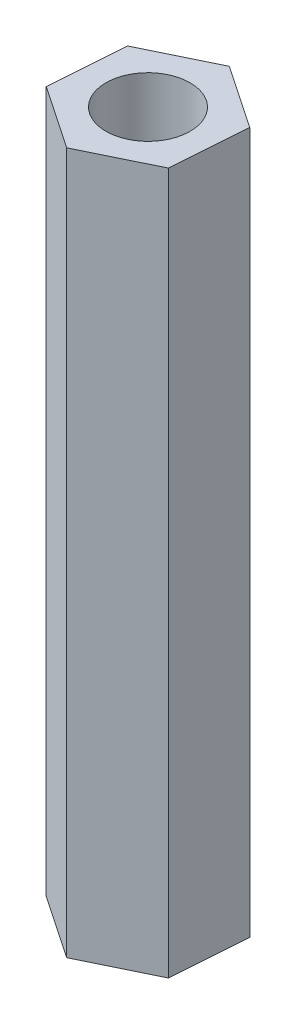
ISO-10303-21;
HEADER;
FILE_DESCRIPTION(('STEP AP214'),'2;1');
FILE_NAME('part.step','',(''),(''),'','','');
FILE_SCHEMA(('AUTOMOTIVE_DESIGN { 1 0 10303 214 1 1 1 1 }'));
ENDSEC;
DATA;
#1=APPLICATION_CONTEXT('core data for automotive mechanical design processes');
#2=APPLICATION_PROTOCOL_DEFINITION('international standard','automotive_design',2000,#1);
#3=PRODUCT_CONTEXT('',#1,'mechanical');
#4=PRODUCT('Part','Part','',(#3));
#5=PRODUCT_RELATED_PRODUCT_CATEGORY('part','',(#4));
#6=PRODUCT_DEFINITION_FORMATION('','',#4);
#7=PRODUCT_DEFINITION_CONTEXT('part definition',#1,'design');
#8=PRODUCT_DEFINITION('design','',#6,#7);
#9=PRODUCT_DEFINITION_SHAPE('','',#8);
#10=(LENGTH_UNIT() NAMED_UNIT(*) SI_UNIT(.MILLI.,.METRE.));
#11=(NAMED_UNIT(*) PLANE_ANGLE_UNIT() SI_UNIT($,.RADIAN.));
#12=(NAMED_UNIT(*) SI_UNIT($,.STERADIAN.) SOLID_ANGLE_UNIT());
#13=UNCERTAINTY_MEASURE_WITH_UNIT(LENGTH_MEASURE(1.E-05),#10,'distance_accuracy_value','');
#14=(GEOMETRIC_REPRESENTATION_CONTEXT(3) GLOBAL_UNCERTAINTY_ASSIGNED_CONTEXT((#13)) GLOBAL_UNIT_ASSIGNED_CONTEXT((#10,
#11,#12)) REPRESENTATION_CONTEXT('',''));
#15=CARTESIAN_POINT('',(0.,0.,0.));
#16=DIRECTION('',(0.,0.,1.));
#17=DIRECTION('',(1.,0.,0.));
#18=AXIS2_PLACEMENT_3D('',#15,#16,#17);
#19=CARTESIAN_POINT('',(2.24764100196597,25.,1.5203431387732));
#20=DIRECTION('',(-0.997471762467216,0.,-0.0710639365680323));
#21=DIRECTION('',(-0.0710639365680323,0.,0.997471762467216));
#22=AXIS2_PLACEMENT_3D('',#19,#20,#21);
#23=PLANE('',#22);
#24=DIRECTION('',(0.0710639365680323,0.,-0.997471762467216));
#25=VECTOR('',#24,1.);
#26=CARTESIAN_POINT('',(2.24764100196597,0.,1.5203431387732));
#27=LINE('',#26,#25);
#28=CARTESIAN_POINT('',(2.24764100196597,0.,1.5203431387732));
#29=VERTEX_POINT('',#28);
#30=CARTESIAN_POINT('',(2.44047628162994,0.,-1.18634263690344));
#31=VERTEX_POINT('',#30);
#32=EDGE_CURVE('E119',#29,#31,#27,.T.);
#33=ORIENTED_EDGE('',*,*,#32,.T.);
#34=DIRECTION('',(0.,-1.,0.));
#35=VECTOR('',#34,1.);
#36=CARTESIAN_POINT('',(2.44047628162994,25.,-1.18634263690344));
#37=LINE('',#36,#35);
#38=CARTESIAN_POINT('',(2.44047628162994,25.,-1.18634263690344));
#39=VERTEX_POINT('',#38);
#40=EDGE_CURVE('E11',#39,#31,#37,.T.);
#41=ORIENTED_EDGE('',*,*,#40,.F.);
#42=DIRECTION('',(0.0710639365680323,0.,-0.997471762467216));
#43=VECTOR('',#42,1.);
#44=CARTESIAN_POINT('',(2.24764100196597,25.,1.5203431387732));
#45=LINE('',#44,#43);
#46=CARTESIAN_POINT('',(2.24764100196597,25.,1.5203431387732));
#47=VERTEX_POINT('',#46);
#48=EDGE_CURVE('E130',#47,#39,#45,.T.);
#49=ORIENTED_EDGE('',*,*,#48,.F.);
#50=DIRECTION('',(0.,-1.,0.));
#51=VECTOR('',#50,1.);
#52=CARTESIAN_POINT('',(2.24764100196597,25.,1.5203431387732));
#53=LINE('',#52,#51);
#54=EDGE_CURVE('E115',#47,#29,#53,.T.);
#55=ORIENTED_EDGE('',*,*,#54,.T.);
#56=EDGE_LOOP('',(#33,#41,#49,#55));
#57=FACE_BOUND('',#56,.T.);
#58=ADVANCED_FACE('F35',(#57),#23,.F.);
#59=CARTESIAN_POINT('',(2.44047628162994,25.,-1.18634263690344));
#60=DIRECTION('',(-0.56027905559445,0.,0.828303917570231));
#61=DIRECTION('',(0.828303917570231,0.,0.56027905559445));
#62=AXIS2_PLACEMENT_3D('',#59,#60,#61);
#63=PLANE('',#62);
#64=DIRECTION('',(-0.82830391757023,0.,-0.56027905559445));
#65=VECTOR('',#64,1.);
#66=CARTESIAN_POINT('',(2.44047628162994,0.,-1.18634263690344));
#67=LINE('',#66,#65);
#68=CARTESIAN_POINT('',(0.192835279663971,0.,-2.70668577567664));
#69=VERTEX_POINT('',#68);
#70=EDGE_CURVE('E122',#31,#69,#67,.T.);
#71=ORIENTED_EDGE('',*,*,#70,.T.);
#72=DIRECTION('',(0.,-1.,0.));
#73=VECTOR('',#72,1.);
#74=CARTESIAN_POINT('',(0.192835279663971,25.,-2.70668577567664));
#75=LINE('',#74,#73);
#76=CARTESIAN_POINT('',(0.192835279663971,25.,-2.70668577567664));
#77=VERTEX_POINT('',#76);
#78=EDGE_CURVE('E43',#77,#69,#75,.T.);
#79=ORIENTED_EDGE('',*,*,#78,.F.);
#80=DIRECTION('',(-0.82830391757023,0.,-0.56027905559445));
#81=VECTOR('',#80,1.);
#82=CARTESIAN_POINT('',(2.44047628162994,25.,-1.18634263690344));
#83=LINE('',#82,#81);
#84=EDGE_CURVE('E88',#39,#77,#83,.T.);
#85=ORIENTED_EDGE('',*,*,#84,.F.);
#86=ORIENTED_EDGE('',*,*,#40,.T.);
#87=EDGE_LOOP('',(#71,#79,#85,#86));
#88=FACE_BOUND('',#87,.T.);
#89=ADVANCED_FACE('F155',(#88),#63,.F.);
#90=CARTESIAN_POINT('',(0.192835279663971,25.,-2.70668577567664));
#91=DIRECTION('',(0.437192706872766,0.,0.899367854138263));
#92=DIRECTION('',(0.899367854138263,0.,-0.437192706872766));
#93=AXIS2_PLACEMENT_3D('',#90,#91,#92);
#94=PLANE('',#93);
#95=DIRECTION('',(-0.899367854138263,0.,0.437192706872766));
#96=VECTOR('',#95,1.);
#97=CARTESIAN_POINT('',(0.192835279663971,0.,-2.70668577567664));
#98=LINE('',#97,#96);
#99=CARTESIAN_POINT('',(-2.24764100196597,0.,-1.5203431387732));
#100=VERTEX_POINT('',#99);
#101=EDGE_CURVE('E125',#69,#100,#98,.T.);
#102=ORIENTED_EDGE('',*,*,#101,.T.);
#103=DIRECTION('',(0.,-1.,0.));
#104=VECTOR('',#103,1.);
#105=CARTESIAN_POINT('',(-2.24764100196597,25.,-1.5203431387732));
#106=LINE('',#105,#104);
#107=CARTESIAN_POINT('',(-2.24764100196597,25.,-1.5203431387732));
#108=VERTEX_POINT('',#107);
#109=EDGE_CURVE('E110',#108,#100,#106,.T.);
#110=ORIENTED_EDGE('',*,*,#109,.F.);
#111=DIRECTION('',(-0.899367854138263,0.,0.437192706872766));
#112=VECTOR('',#111,1.);
#113=CARTESIAN_POINT('',(0.192835279663971,25.,-2.70668577567664));
#114=LINE('',#113,#112);
#115=EDGE_CURVE('E101',#77,#108,#114,.T.);
#116=ORIENTED_EDGE('',*,*,#115,.F.);
#117=ORIENTED_EDGE('',*,*,#78,.T.);
#118=EDGE_LOOP('',(#102,#110,#116,#117));
#119=FACE_BOUND('',#118,.T.);
#120=ADVANCED_FACE('F136',(#119),#94,.F.);
#121=CARTESIAN_POINT('',(-2.24764100196597,25.,-1.5203431387732));
#122=DIRECTION('',(0.997471762467216,0.,0.0710639365680325));
#123=DIRECTION('',(0.0710639365680325,0.,-0.997471762467216));
#124=AXIS2_PLACEMENT_3D('',#121,#122,#123);
#125=PLANE('',#124);
#126=DIRECTION('',(-0.0710639365680325,0.,0.997471762467216));
#127=VECTOR('',#126,1.);
#128=CARTESIAN_POINT('',(-2.24764100196597,0.,-1.5203431387732));
#129=LINE('',#128,#127);
#130=CARTESIAN_POINT('',(-2.44047628162994,0.,1.18634263690344));
#131=VERTEX_POINT('',#130);
#132=EDGE_CURVE('E109',#100,#131,#129,.T.);
#133=ORIENTED_EDGE('',*,*,#132,.T.);
#134=DIRECTION('',(0.,-1.,0.));
#135=VECTOR('',#134,1.);
#136=CARTESIAN_POINT('',(-2.44047628162994,25.,1.18634263690344));
#137=LINE('',#136,#135);
#138=CARTESIAN_POINT('',(-2.44047628162994,25.,1.18634263690344));
#139=VERTEX_POINT('',#138);
#140=EDGE_CURVE('E106',#139,#131,#137,.T.);
#141=ORIENTED_EDGE('',*,*,#140,.F.);
#142=DIRECTION('',(-0.0710639365680325,0.,0.997471762467216));
#143=VECTOR('',#142,1.);
#144=CARTESIAN_POINT('',(-2.24764100196597,25.,-1.5203431387732));
#145=LINE('',#144,#143);
#146=EDGE_CURVE('E95',#108,#139,#145,.T.);
#147=ORIENTED_EDGE('',*,*,#146,.F.);
#148=ORIENTED_EDGE('',*,*,#109,.T.);
#149=EDGE_LOOP('',(#133,#141,#147,#148));
#150=FACE_BOUND('',#149,.T.);
#151=ADVANCED_FACE('F107',(#150),#125,.F.);
#152=CARTESIAN_POINT('',(-2.44047628162994,25.,1.18634263690344));
#153=DIRECTION('',(0.56027905559445,0.,-0.82830391757023));
#154=DIRECTION('',(-0.82830391757023,0.,-0.56027905559445));
#155=AXIS2_PLACEMENT_3D('',#152,#153,#154);
#156=PLANE('',#155);
#157=DIRECTION('',(0.82830391757023,0.,0.56027905559445));
#158=VECTOR('',#157,1.);
#159=CARTESIAN_POINT('',(-2.44047628162994,0.,1.18634263690344));
#160=LINE('',#159,#158);
#161=CARTESIAN_POINT('',(-0.192835279663971,0.,2.70668577567664));
#162=VERTEX_POINT('',#161);
#163=EDGE_CURVE('E74',#131,#162,#160,.T.);
#164=ORIENTED_EDGE('',*,*,#163,.T.);
#165=DIRECTION('',(0.,-1.,0.));
#166=VECTOR('',#165,1.);
#167=CARTESIAN_POINT('',(-0.192835279663971,25.,2.70668577567664));
#168=LINE('',#167,#166);
#169=CARTESIAN_POINT('',(-0.192835279663971,25.,2.70668577567664));
#170=VERTEX_POINT('',#169);
#171=EDGE_CURVE('E111',#170,#162,#168,.T.);
#172=ORIENTED_EDGE('',*,*,#171,.F.);
#173=DIRECTION('',(0.82830391757023,0.,0.56027905559445));
#174=VECTOR('',#173,1.);
#175=CARTESIAN_POINT('',(-2.44047628162994,25.,1.18634263690344));
#176=LINE('',#175,#174);
#177=EDGE_CURVE('E99',#139,#170,#176,.T.);
#178=ORIENTED_EDGE('',*,*,#177,.F.);
#179=ORIENTED_EDGE('',*,*,#140,.T.);
#180=EDGE_LOOP('',(#164,#172,#178,#179));
#181=FACE_BOUND('',#180,.T.);
#182=ADVANCED_FACE('F113',(#181),#156,.F.);
#183=CARTESIAN_POINT('',(-0.192835279663971,25.,2.70668577567664));
#184=DIRECTION('',(-0.437192706872766,0.,-0.899367854138263));
#185=DIRECTION('',(-0.899367854138263,0.,0.437192706872766));
#186=AXIS2_PLACEMENT_3D('',#183,#184,#185);
#187=PLANE('',#186);
#188=DIRECTION('',(0.899367854138263,0.,-0.437192706872766));
#189=VECTOR('',#188,1.);
#190=CARTESIAN_POINT('',(-0.192835279663971,0.,2.70668577567664));
#191=LINE('',#190,#189);
#192=EDGE_CURVE('E80',#162,#29,#191,.T.);
#193=ORIENTED_EDGE('',*,*,#192,.T.);
#194=ORIENTED_EDGE('',*,*,#54,.F.);
#195=DIRECTION('',(0.899367854138263,0.,-0.437192706872766));
#196=VECTOR('',#195,1.);
#197=CARTESIAN_POINT('',(-0.192835279663971,25.,2.70668577567664));
#198=LINE('',#197,#196);
#199=EDGE_CURVE('E51',#170,#47,#198,.T.);
#200=ORIENTED_EDGE('',*,*,#199,.F.);
#201=ORIENTED_EDGE('',*,*,#171,.T.);
#202=EDGE_LOOP('',(#193,#194,#200,#201));
#203=FACE_BOUND('',#202,.T.);
#204=ADVANCED_FACE('F143',(#203),#187,.F.);
#205=CARTESIAN_POINT('',(0.,25.,0.));
#206=DIRECTION('',(0.,1.,0.));
#207=DIRECTION('',(0.,0.,1.));
#208=AXIS2_PLACEMENT_3D('',#205,#206,#207);
#209=PLANE('',#208);
#210=CARTESIAN_POINT('',(0.,25.,0.));
#211=DIRECTION('',(0.,-1.,0.));
#212=DIRECTION('',(0.,0.,-1.));
#213=AXIS2_PLACEMENT_3D('',#210,#211,#212);
#214=CIRCLE('',#213,1.5);
#215=CARTESIAN_POINT('',(0.,25.,-1.5));
#216=VERTEX_POINT('',#215);
#217=EDGE_CURVE('E123',#216,#216,#214,.T.);
#218=ORIENTED_EDGE('',*,*,#217,.T.);
#219=EDGE_LOOP('',(#218));
#220=FACE_BOUND('',#219,.T.);
#221=ORIENTED_EDGE('',*,*,#48,.T.);
#222=ORIENTED_EDGE('',*,*,#84,.T.);
#223=ORIENTED_EDGE('',*,*,#115,.T.);
#224=ORIENTED_EDGE('',*,*,#146,.T.);
#225=ORIENTED_EDGE('',*,*,#177,.T.);
#226=ORIENTED_EDGE('',*,*,#199,.T.);
#227=EDGE_LOOP('',(#221,#222,#223,#224,#225,#226));
#228=FACE_BOUND('',#227,.T.);
#229=ADVANCED_FACE('F97',(#220,#228),#209,.T.);
#230=CARTESIAN_POINT('',(0.,0.,0.));
#231=DIRECTION('',(0.,1.,0.));
#232=DIRECTION('',(0.,0.,1.));
#233=AXIS2_PLACEMENT_3D('',#230,#231,#232);
#234=PLANE('',#233);
#235=CARTESIAN_POINT('',(0.,0.,0.));
#236=DIRECTION('',(0.,-1.,0.));
#237=DIRECTION('',(0.,0.,-1.));
#238=AXIS2_PLACEMENT_3D('',#235,#236,#237);
#239=CIRCLE('',#238,1.5);
#240=CARTESIAN_POINT('',(0.,0.,-1.5));
#241=VERTEX_POINT('',#240);
#242=EDGE_CURVE('E210',#241,#241,#239,.T.);
#243=ORIENTED_EDGE('',*,*,#242,.F.);
#244=EDGE_LOOP('',(#243));
#245=FACE_BOUND('',#244,.T.);
#246=ORIENTED_EDGE('',*,*,#32,.F.);
#247=ORIENTED_EDGE('',*,*,#192,.F.);
#248=ORIENTED_EDGE('',*,*,#163,.F.);
#249=ORIENTED_EDGE('',*,*,#132,.F.);
#250=ORIENTED_EDGE('',*,*,#101,.F.);
#251=ORIENTED_EDGE('',*,*,#70,.F.);
#252=EDGE_LOOP('',(#246,#247,#248,#249,#250,#251));
#253=FACE_BOUND('',#252,.T.);
#254=ADVANCED_FACE('F139',(#245,#253),#234,.F.);
#255=CARTESIAN_POINT('',(0.,25.,0.));
#256=DIRECTION('',(0.,-1.,0.));
#257=DIRECTION('',(0.,0.,-1.));
#258=AXIS2_PLACEMENT_3D('',#255,#256,#257);
#259=CYLINDRICAL_SURFACE('',#258,1.5);
#260=ORIENTED_EDGE('',*,*,#217,.F.);
#261=EDGE_LOOP('',(#260));
#262=FACE_BOUND('',#261,.T.);
#263=ORIENTED_EDGE('',*,*,#242,.T.);
#264=EDGE_LOOP('',(#263));
#265=FACE_BOUND('',#264,.T.);
#266=ADVANCED_FACE('F192',(#262,#265),#259,.F.);
#267=CLOSED_SHELL('',(#58,#89,#120,#151,#182,#204,#229,#254,#266));
#268=MANIFOLD_SOLID_BREP('B2',#267);
#269=ADVANCED_BREP_SHAPE_REPRESENTATION('',(#18,#268),#14);
#270=SHAPE_DEFINITION_REPRESENTATION(#9,#269);
ENDSEC;
END-ISO-10303-21;
